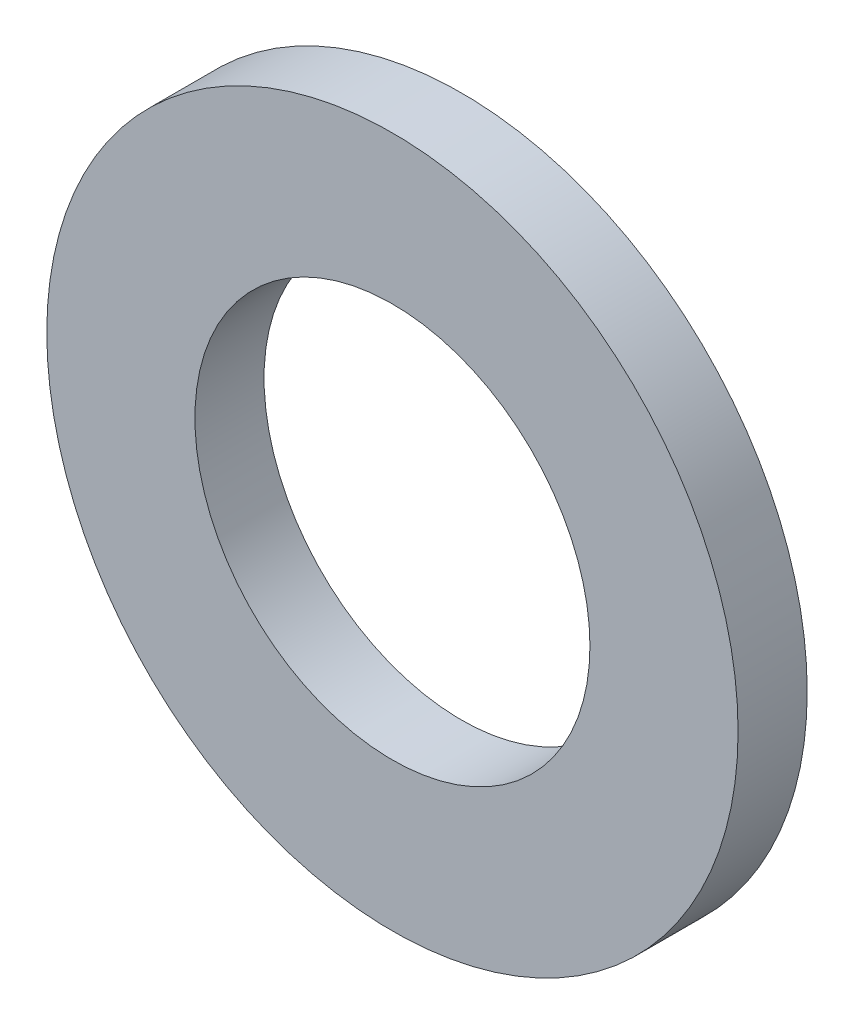
ISO-10303-21;
HEADER;
FILE_DESCRIPTION(('STEP AP214'),'2;1');
FILE_NAME('part.step','',(''),(''),'','','');
FILE_SCHEMA(('AUTOMOTIVE_DESIGN { 1 0 10303 214 1 1 1 1 }'));
ENDSEC;
DATA;
#1=APPLICATION_CONTEXT('core data for automotive mechanical design processes');
#2=APPLICATION_PROTOCOL_DEFINITION('international standard','automotive_design',2000,#1);
#3=PRODUCT_CONTEXT('',#1,'mechanical');
#4=PRODUCT('Part','Part','',(#3));
#5=PRODUCT_RELATED_PRODUCT_CATEGORY('part','',(#4));
#6=PRODUCT_DEFINITION_FORMATION('','',#4);
#7=PRODUCT_DEFINITION_CONTEXT('part definition',#1,'design');
#8=PRODUCT_DEFINITION('design','',#6,#7);
#9=PRODUCT_DEFINITION_SHAPE('','',#8);
#10=(LENGTH_UNIT() NAMED_UNIT(*) SI_UNIT(.MILLI.,.METRE.));
#11=(NAMED_UNIT(*) PLANE_ANGLE_UNIT() SI_UNIT($,.RADIAN.));
#12=(NAMED_UNIT(*) SI_UNIT($,.STERADIAN.) SOLID_ANGLE_UNIT());
#13=UNCERTAINTY_MEASURE_WITH_UNIT(LENGTH_MEASURE(1.E-05),#10,'distance_accuracy_value','');
#14=(GEOMETRIC_REPRESENTATION_CONTEXT(3) GLOBAL_UNCERTAINTY_ASSIGNED_CONTEXT((#13)) GLOBAL_UNIT_ASSIGNED_CONTEXT((#10,
#11,#12)) REPRESENTATION_CONTEXT('',''));
#15=CARTESIAN_POINT('',(0.,0.,0.));
#16=DIRECTION('',(0.,0.,1.));
#17=DIRECTION('',(1.,0.,0.));
#18=AXIS2_PLACEMENT_3D('',#15,#16,#17);
#19=CARTESIAN_POINT('',(0.,0.,0.7));
#20=DIRECTION('',(0.,0.,1.));
#21=DIRECTION('',(1.,0.,0.));
#22=AXIS2_PLACEMENT_3D('',#19,#20,#21);
#23=PLANE('',#22);
#24=CARTESIAN_POINT('',(0.,0.,0.7));
#25=DIRECTION('',(0.,0.,1.));
#26=DIRECTION('',(1.,0.,0.));
#27=AXIS2_PLACEMENT_3D('',#24,#25,#26);
#28=CIRCLE('',#27,3.5);
#29=CARTESIAN_POINT('',(3.5,0.,0.7));
#30=VERTEX_POINT('',#29);
#31=EDGE_CURVE('E10',#30,#30,#28,.T.);
#32=ORIENTED_EDGE('',*,*,#31,.T.);
#33=EDGE_LOOP('',(#32));
#34=FACE_BOUND('',#33,.T.);
#35=CARTESIAN_POINT('',(0.,0.,0.7));
#36=DIRECTION('',(0.,0.,1.));
#37=DIRECTION('',(1.,0.,0.));
#38=AXIS2_PLACEMENT_3D('',#35,#36,#37);
#39=CIRCLE('',#38,2.);
#40=CARTESIAN_POINT('',(2.,0.,0.7));
#41=VERTEX_POINT('',#40);
#42=EDGE_CURVE('E51',#41,#41,#39,.T.);
#43=ORIENTED_EDGE('',*,*,#42,.F.);
#44=EDGE_LOOP('',(#43));
#45=FACE_BOUND('',#44,.T.);
#46=ADVANCED_FACE('F40',(#34,#45),#23,.T.);
#47=CARTESIAN_POINT('',(0.,0.,0.));
#48=DIRECTION('',(0.,0.,1.));
#49=DIRECTION('',(1.,0.,0.));
#50=AXIS2_PLACEMENT_3D('',#47,#48,#49);
#51=PLANE('',#50);
#52=CARTESIAN_POINT('',(0.,0.,0.));
#53=DIRECTION('',(0.,0.,1.));
#54=DIRECTION('',(1.,0.,0.));
#55=AXIS2_PLACEMENT_3D('',#52,#53,#54);
#56=CIRCLE('',#55,3.5);
#57=CARTESIAN_POINT('',(3.5,0.,0.));
#58=VERTEX_POINT('',#57);
#59=EDGE_CURVE('E44',#58,#58,#56,.T.);
#60=ORIENTED_EDGE('',*,*,#59,.F.);
#61=EDGE_LOOP('',(#60));
#62=FACE_BOUND('',#61,.T.);
#63=CARTESIAN_POINT('',(0.,0.,0.));
#64=DIRECTION('',(0.,0.,1.));
#65=DIRECTION('',(1.,0.,0.));
#66=AXIS2_PLACEMENT_3D('',#63,#64,#65);
#67=CIRCLE('',#66,2.);
#68=CARTESIAN_POINT('',(2.,0.,0.));
#69=VERTEX_POINT('',#68);
#70=EDGE_CURVE('E53',#69,#69,#67,.T.);
#71=ORIENTED_EDGE('',*,*,#70,.T.);
#72=EDGE_LOOP('',(#71));
#73=FACE_BOUND('',#72,.T.);
#74=ADVANCED_FACE('F63',(#62,#73),#51,.F.);
#75=CARTESIAN_POINT('',(0.,0.,0.7));
#76=DIRECTION('',(0.,0.,-1.));
#77=DIRECTION('',(-1.,0.,0.));
#78=AXIS2_PLACEMENT_3D('',#75,#76,#77);
#79=CYLINDRICAL_SURFACE('',#78,3.5);
#80=ORIENTED_EDGE('',*,*,#31,.F.);
#81=EDGE_LOOP('',(#80));
#82=FACE_BOUND('',#81,.T.);
#83=ORIENTED_EDGE('',*,*,#59,.T.);
#84=EDGE_LOOP('',(#83));
#85=FACE_BOUND('',#84,.T.);
#86=ADVANCED_FACE('F42',(#82,#85),#79,.T.);
#87=CARTESIAN_POINT('',(0.,0.,0.7));
#88=DIRECTION('',(0.,0.,-1.));
#89=DIRECTION('',(-1.,0.,0.));
#90=AXIS2_PLACEMENT_3D('',#87,#88,#89);
#91=CYLINDRICAL_SURFACE('',#90,2.);
#92=ORIENTED_EDGE('',*,*,#42,.T.);
#93=EDGE_LOOP('',(#92));
#94=FACE_BOUND('',#93,.T.);
#95=ORIENTED_EDGE('',*,*,#70,.F.);
#96=EDGE_LOOP('',(#95));
#97=FACE_BOUND('',#96,.T.);
#98=ADVANCED_FACE('F59',(#94,#97),#91,.F.);
#99=CLOSED_SHELL('',(#46,#74,#86,#98));
#100=MANIFOLD_SOLID_BREP('B2',#99);
#101=ADVANCED_BREP_SHAPE_REPRESENTATION('',(#18,#100),#14);
#102=SHAPE_DEFINITION_REPRESENTATION(#9,#101);
ENDSEC;
END-ISO-10303-21;
